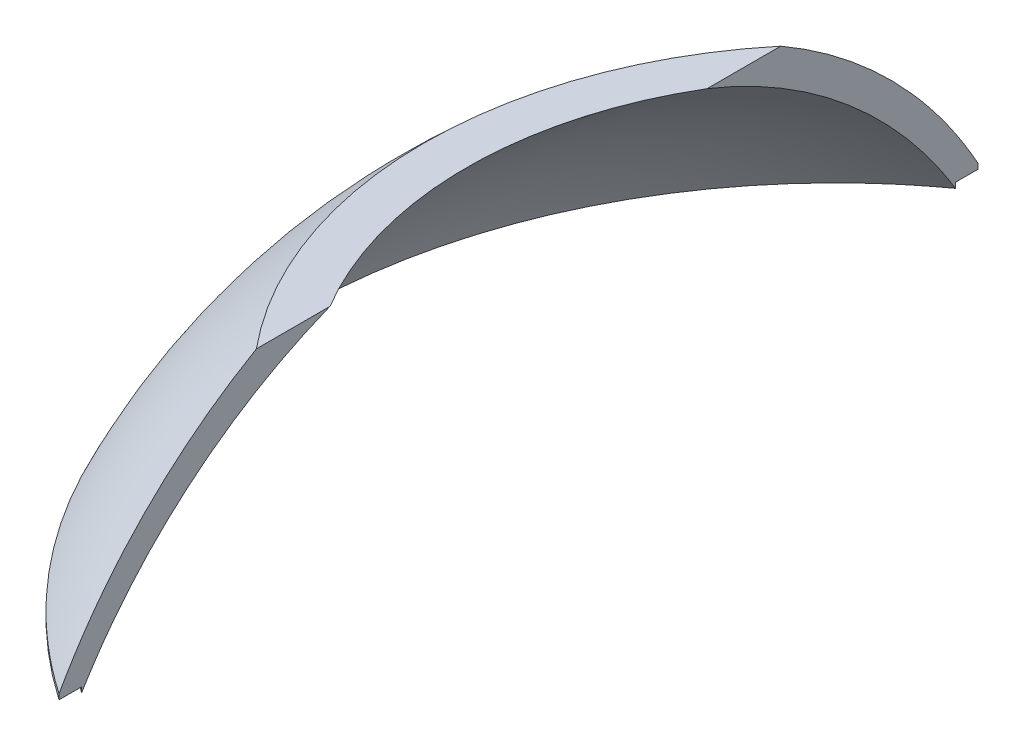
ISO-10303-21;
HEADER;
FILE_DESCRIPTION(('STEP AP214'),'2;1');
FILE_NAME('part.step','',(''),(''),'','','');
FILE_SCHEMA(('AUTOMOTIVE_DESIGN { 1 0 10303 214 1 1 1 1 }'));
ENDSEC;
DATA;
#1=APPLICATION_CONTEXT('core data for automotive mechanical design processes');
#2=APPLICATION_PROTOCOL_DEFINITION('international standard','automotive_design',2000,#1);
#3=PRODUCT_CONTEXT('',#1,'mechanical');
#4=PRODUCT('Part','Part','',(#3));
#5=PRODUCT_RELATED_PRODUCT_CATEGORY('part','',(#4));
#6=PRODUCT_DEFINITION_FORMATION('','',#4);
#7=PRODUCT_DEFINITION_CONTEXT('part definition',#1,'design');
#8=PRODUCT_DEFINITION('design','',#6,#7);
#9=PRODUCT_DEFINITION_SHAPE('','',#8);
#10=(LENGTH_UNIT() NAMED_UNIT(*) SI_UNIT(.MILLI.,.METRE.));
#11=(NAMED_UNIT(*) PLANE_ANGLE_UNIT() SI_UNIT($,.RADIAN.));
#12=(NAMED_UNIT(*) SI_UNIT($,.STERADIAN.) SOLID_ANGLE_UNIT());
#13=UNCERTAINTY_MEASURE_WITH_UNIT(LENGTH_MEASURE(1.E-05),#10,'distance_accuracy_value','');
#14=(GEOMETRIC_REPRESENTATION_CONTEXT(3) GLOBAL_UNCERTAINTY_ASSIGNED_CONTEXT((#13)) GLOBAL_UNIT_ASSIGNED_CONTEXT((#10,
#11,#12)) REPRESENTATION_CONTEXT('',''));
#15=CARTESIAN_POINT('',(0.,0.,0.));
#16=DIRECTION('',(0.,0.,1.));
#17=DIRECTION('',(1.,0.,0.));
#18=AXIS2_PLACEMENT_3D('',#15,#16,#17);
#19=CARTESIAN_POINT('',(0.,-47.6176470588235,0.));
#20=DIRECTION('',(0.,0.,1.));
#21=DIRECTION('',(1.,0.,0.));
#22=AXIS2_PLACEMENT_3D('',#19,#20,#21);
#23=SPHERICAL_SURFACE('',#22,116.617647058824);
#24=CARTESIAN_POINT('',(-60.1391512836642,-47.6176470588235,0.));
#25=DIRECTION('',(-1.,0.,0.));
#26=DIRECTION('',(0.,0.,1.));
#27=AXIS2_PLACEMENT_3D('',#24,#25,#26);
#28=CIRCLE('',#27,99.9147541077737);
#29=CARTESIAN_POINT('',(-60.1391512836642,1.,-87.2885014356447));
#30=VERTEX_POINT('',#29);
#31=CARTESIAN_POINT('',(-60.1391512836642,39.,-49.8030250728805));
#32=VERTEX_POINT('',#31);
#33=EDGE_CURVE('E55',#30,#32,#28,.F.);
#34=ORIENTED_EDGE('',*,*,#33,.F.);
#35=CARTESIAN_POINT('',(0.,1.,0.));
#36=DIRECTION('',(0.,1.,0.));
#37=DIRECTION('',(0.,0.,1.));
#38=AXIS2_PLACEMENT_3D('',#35,#36,#37);
#39=CIRCLE('',#38,106.);
#40=CARTESIAN_POINT('',(-60.1391512836641,1.,87.2885014356448));
#41=VERTEX_POINT('',#40);
#42=EDGE_CURVE('E106',#30,#41,#39,.T.);
#43=ORIENTED_EDGE('',*,*,#42,.T.);
#44=CARTESIAN_POINT('',(-60.1391512836642,39.,49.8030250728806));
#45=VERTEX_POINT('',#44);
#46=EDGE_CURVE('E100',#45,#41,#28,.F.);
#47=ORIENTED_EDGE('',*,*,#46,.F.);
#48=CARTESIAN_POINT('',(0.,39.,0.));
#49=DIRECTION('',(0.,1.,0.));
#50=DIRECTION('',(0.,0.,1.));
#51=AXIS2_PLACEMENT_3D('',#48,#49,#50);
#52=CIRCLE('',#51,78.0836655359456);
#53=EDGE_CURVE('E99',#45,#32,#52,.F.);
#54=ORIENTED_EDGE('',*,*,#53,.T.);
#55=EDGE_LOOP('',(#34,#43,#47,#54));
#56=FACE_BOUND('',#55,.T.);
#57=ADVANCED_FACE('F33',(#56),#23,.T.);
#58=CARTESIAN_POINT('',(0.,-51.080078125,0.));
#59=DIRECTION('',(0.,0.,1.));
#60=DIRECTION('',(1.,0.,0.));
#61=AXIS2_PLACEMENT_3D('',#58,#59,#60);
#62=SPHERICAL_SURFACE('',#61,114.080078125);
#63=CARTESIAN_POINT('',(-60.1391512836642,-51.080078125,0.));
#64=DIRECTION('',(-1.,0.,0.));
#65=DIRECTION('',(0.,0.,1.));
#66=AXIS2_PLACEMENT_3D('',#63,#64,#65);
#67=CIRCLE('',#66,96.9409444346745);
#68=CARTESIAN_POINT('',(-60.1391512836641,-1.,83.0032076662135));
#69=VERTEX_POINT('',#68);
#70=CARTESIAN_POINT('',(-60.1391512836641,39.,35.8207514281953));
#71=VERTEX_POINT('',#70);
#72=EDGE_CURVE('E48',#69,#71,#67,.T.);
#73=ORIENTED_EDGE('',*,*,#72,.F.);
#74=CARTESIAN_POINT('',(0.,-1.,0.));
#75=DIRECTION('',(0.,-1.,0.));
#76=DIRECTION('',(0.,0.,-1.));
#77=AXIS2_PLACEMENT_3D('',#74,#75,#76);
#78=CIRCLE('',#77,102.5);
#79=CARTESIAN_POINT('',(-60.1391512836642,-1.,-83.0032076662134));
#80=VERTEX_POINT('',#79);
#81=EDGE_CURVE('E95',#69,#80,#78,.T.);
#82=ORIENTED_EDGE('',*,*,#81,.T.);
#83=CARTESIAN_POINT('',(-60.1391512836642,39.,-35.8207514281953));
#84=VERTEX_POINT('',#83);
#85=EDGE_CURVE('E84',#84,#80,#67,.T.);
#86=ORIENTED_EDGE('',*,*,#85,.F.);
#87=CARTESIAN_POINT('',(0.,39.,0.));
#88=DIRECTION('',(0.,1.,0.));
#89=DIRECTION('',(0.,0.,1.));
#90=AXIS2_PLACEMENT_3D('',#87,#88,#89);
#91=CIRCLE('',#90,69.998883919674);
#92=EDGE_CURVE('E93',#84,#71,#91,.T.);
#93=ORIENTED_EDGE('',*,*,#92,.T.);
#94=EDGE_LOOP('',(#73,#82,#86,#93));
#95=FACE_BOUND('',#94,.T.);
#96=ADVANCED_FACE('F35',(#95),#62,.F.);
#97=CARTESIAN_POINT('',(0.,1.,0.));
#98=DIRECTION('',(0.,-1.,0.));
#99=DIRECTION('',(0.,0.,-1.));
#100=AXIS2_PLACEMENT_3D('',#97,#98,#99);
#101=CYLINDRICAL_SURFACE('',#100,106.);
#102=ORIENTED_EDGE('',*,*,#42,.F.);
#103=DIRECTION('',(0.,-1.,0.));
#104=VECTOR('',#103,1.);
#105=CARTESIAN_POINT('',(-60.1391512836642,1.,-87.2885014356447));
#106=LINE('',#105,#104);
#107=CARTESIAN_POINT('',(-60.1391512836642,0.,-87.2885014356447));
#108=VERTEX_POINT('',#107);
#109=EDGE_CURVE('E96',#30,#108,#106,.T.);
#110=ORIENTED_EDGE('',*,*,#109,.T.);
#111=CARTESIAN_POINT('',(0.,0.,0.));
#112=DIRECTION('',(0.,1.,0.));
#113=DIRECTION('',(0.,0.,1.));
#114=AXIS2_PLACEMENT_3D('',#111,#112,#113);
#115=CIRCLE('',#114,106.);
#116=CARTESIAN_POINT('',(-60.1391512836641,0.,87.2885014356448));
#117=VERTEX_POINT('',#116);
#118=EDGE_CURVE('E105',#108,#117,#115,.T.);
#119=ORIENTED_EDGE('',*,*,#118,.T.);
#120=DIRECTION('',(0.,-1.,0.));
#121=VECTOR('',#120,1.);
#122=CARTESIAN_POINT('',(-60.1391512836641,1.,87.2885014356448));
#123=LINE('',#122,#121);
#124=EDGE_CURVE('E114',#117,#41,#123,.F.);
#125=ORIENTED_EDGE('',*,*,#124,.T.);
#126=EDGE_LOOP('',(#102,#110,#119,#125));
#127=FACE_BOUND('',#126,.T.);
#128=ADVANCED_FACE('F136',(#127),#101,.T.);
#129=CARTESIAN_POINT('',(0.,0.,0.));
#130=DIRECTION('',(0.,1.,0.));
#131=DIRECTION('',(0.,0.,1.));
#132=AXIS2_PLACEMENT_3D('',#129,#130,#131);
#133=PLANE('',#132);
#134=ORIENTED_EDGE('',*,*,#118,.F.);
#135=DIRECTION('',(0.,0.,1.));
#136=VECTOR('',#135,1.);
#137=CARTESIAN_POINT('',(-60.1391512836642,0.,0.));
#138=LINE('',#137,#136);
#139=CARTESIAN_POINT('',(-60.1391512836642,0.,-83.0032076662134));
#140=VERTEX_POINT('',#139);
#141=EDGE_CURVE('E123',#108,#140,#138,.T.);
#142=ORIENTED_EDGE('',*,*,#141,.T.);
#143=CARTESIAN_POINT('',(0.,0.,0.));
#144=DIRECTION('',(0.,-1.,0.));
#145=DIRECTION('',(0.,0.,-1.));
#146=AXIS2_PLACEMENT_3D('',#143,#144,#145);
#147=CIRCLE('',#146,102.5);
#148=CARTESIAN_POINT('',(-60.1391512836641,0.,83.0032076662135));
#149=VERTEX_POINT('',#148);
#150=EDGE_CURVE('E109',#149,#140,#147,.T.);
#151=ORIENTED_EDGE('',*,*,#150,.F.);
#152=EDGE_CURVE('E117',#149,#117,#138,.T.);
#153=ORIENTED_EDGE('',*,*,#152,.T.);
#154=EDGE_LOOP('',(#134,#142,#151,#153));
#155=FACE_BOUND('',#154,.T.);
#156=ADVANCED_FACE('F132',(#155),#133,.F.);
#157=CARTESIAN_POINT('',(0.,-1.,0.));
#158=DIRECTION('',(0.,1.,0.));
#159=DIRECTION('',(0.,0.,1.));
#160=AXIS2_PLACEMENT_3D('',#157,#158,#159);
#161=CYLINDRICAL_SURFACE('',#160,102.5);
#162=ORIENTED_EDGE('',*,*,#81,.F.);
#163=DIRECTION('',(0.,1.,0.));
#164=VECTOR('',#163,1.);
#165=CARTESIAN_POINT('',(-60.1391512836641,-1.,83.0032076662135));
#166=LINE('',#165,#164);
#167=EDGE_CURVE('E118',#69,#149,#166,.T.);
#168=ORIENTED_EDGE('',*,*,#167,.T.);
#169=ORIENTED_EDGE('',*,*,#150,.T.);
#170=DIRECTION('',(0.,1.,0.));
#171=VECTOR('',#170,1.);
#172=CARTESIAN_POINT('',(-60.1391512836642,-1.,-83.0032076662134));
#173=LINE('',#172,#171);
#174=EDGE_CURVE('E126',#140,#80,#173,.F.);
#175=ORIENTED_EDGE('',*,*,#174,.T.);
#176=EDGE_LOOP('',(#162,#168,#169,#175));
#177=FACE_BOUND('',#176,.T.);
#178=ADVANCED_FACE('F128',(#177),#161,.T.);
#179=CARTESIAN_POINT('',(0.,39.,0.));
#180=DIRECTION('',(0.,1.,0.));
#181=DIRECTION('',(0.,0.,1.));
#182=AXIS2_PLACEMENT_3D('',#179,#180,#181);
#183=PLANE('',#182);
#184=DIRECTION('',(0.,0.,1.));
#185=VECTOR('',#184,1.);
#186=CARTESIAN_POINT('',(-60.1391512836642,39.,0.));
#187=LINE('',#186,#185);
#188=EDGE_CURVE('E11',#32,#84,#187,.T.);
#189=ORIENTED_EDGE('',*,*,#188,.F.);
#190=ORIENTED_EDGE('',*,*,#53,.F.);
#191=EDGE_CURVE('E37',#71,#45,#187,.T.);
#192=ORIENTED_EDGE('',*,*,#191,.F.);
#193=ORIENTED_EDGE('',*,*,#92,.F.);
#194=EDGE_LOOP('',(#189,#190,#192,#193));
#195=FACE_BOUND('',#194,.T.);
#196=ADVANCED_FACE('F98',(#195),#183,.T.);
#197=CARTESIAN_POINT('',(-60.1391512836642,-22.,-135.53615835142));
#198=DIRECTION('',(-1.,0.,0.));
#199=DIRECTION('',(0.,0.,1.));
#200=AXIS2_PLACEMENT_3D('',#197,#198,#199);
#201=PLANE('',#200);
#202=ORIENTED_EDGE('',*,*,#46,.T.);
#203=ORIENTED_EDGE('',*,*,#124,.F.);
#204=ORIENTED_EDGE('',*,*,#152,.F.);
#205=ORIENTED_EDGE('',*,*,#167,.F.);
#206=ORIENTED_EDGE('',*,*,#72,.T.);
#207=ORIENTED_EDGE('',*,*,#191,.T.);
#208=EDGE_LOOP('',(#202,#203,#204,#205,#206,#207));
#209=FACE_BOUND('',#208,.T.);
#210=ADVANCED_FACE('F139',(#209),#201,.F.);
#211=ORIENTED_EDGE('',*,*,#33,.T.);
#212=ORIENTED_EDGE('',*,*,#188,.T.);
#213=ORIENTED_EDGE('',*,*,#85,.T.);
#214=ORIENTED_EDGE('',*,*,#174,.F.);
#215=ORIENTED_EDGE('',*,*,#141,.F.);
#216=ORIENTED_EDGE('',*,*,#109,.F.);
#217=EDGE_LOOP('',(#211,#212,#213,#214,#215,#216));
#218=FACE_BOUND('',#217,.T.);
#219=ADVANCED_FACE('F83',(#218),#201,.F.);
#220=CLOSED_SHELL('',(#57,#96,#128,#156,#178,#196,#210,#219));
#221=MANIFOLD_SOLID_BREP('B2',#220);
#222=ADVANCED_BREP_SHAPE_REPRESENTATION('',(#18,#221),#14);
#223=SHAPE_DEFINITION_REPRESENTATION(#9,#222);
ENDSEC;
END-ISO-10303-21;
